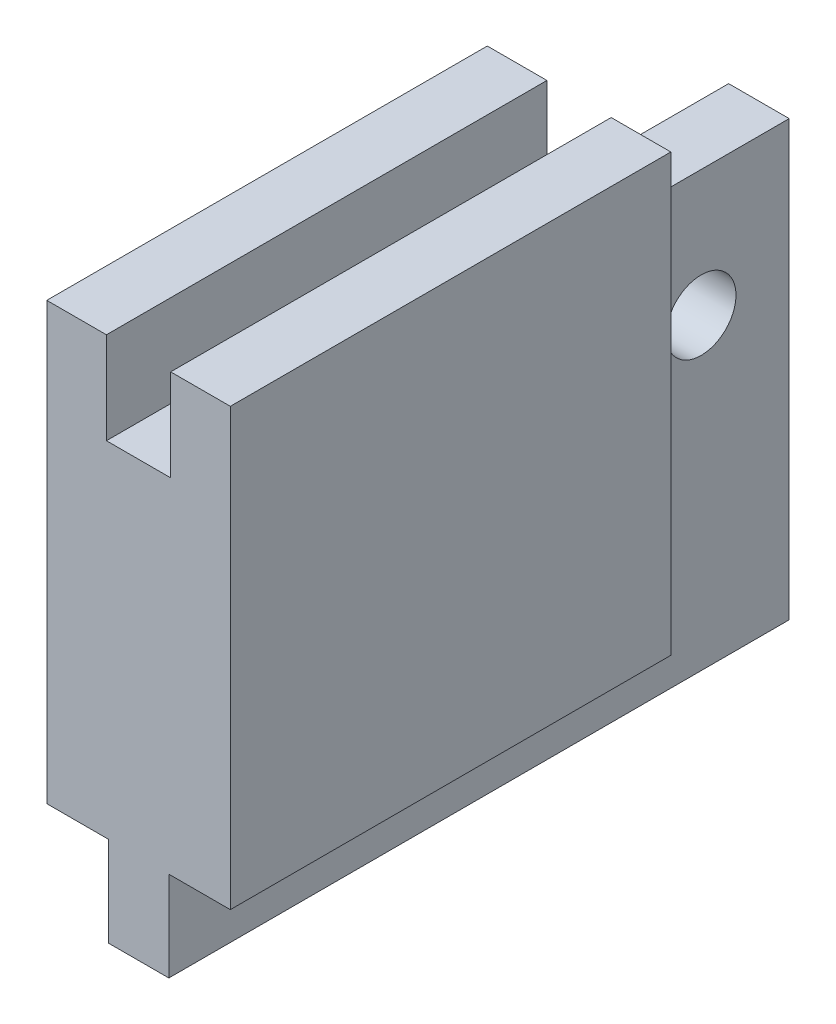
ISO-10303-21;
HEADER;
FILE_DESCRIPTION(('STEP AP214'),'2;1');
FILE_NAME('part.step','',(''),(''),'','','');
FILE_SCHEMA(('AUTOMOTIVE_DESIGN { 1 0 10303 214 1 1 1 1 }'));
ENDSEC;
DATA;
#1=APPLICATION_CONTEXT('core data for automotive mechanical design processes');
#2=APPLICATION_PROTOCOL_DEFINITION('international standard','automotive_design',2000,#1);
#3=PRODUCT_CONTEXT('',#1,'mechanical');
#4=PRODUCT('Part','Part','',(#3));
#5=PRODUCT_RELATED_PRODUCT_CATEGORY('part','',(#4));
#6=PRODUCT_DEFINITION_FORMATION('','',#4);
#7=PRODUCT_DEFINITION_CONTEXT('part definition',#1,'design');
#8=PRODUCT_DEFINITION('design','',#6,#7);
#9=PRODUCT_DEFINITION_SHAPE('','',#8);
#10=(LENGTH_UNIT() NAMED_UNIT(*) SI_UNIT(.MILLI.,.METRE.));
#11=(NAMED_UNIT(*) PLANE_ANGLE_UNIT() SI_UNIT($,.RADIAN.));
#12=(NAMED_UNIT(*) SI_UNIT($,.STERADIAN.) SOLID_ANGLE_UNIT());
#13=UNCERTAINTY_MEASURE_WITH_UNIT(LENGTH_MEASURE(1.E-05),#10,'distance_accuracy_value','');
#14=(GEOMETRIC_REPRESENTATION_CONTEXT(3) GLOBAL_UNCERTAINTY_ASSIGNED_CONTEXT((#13)) GLOBAL_UNIT_ASSIGNED_CONTEXT((#10,
#11,#12)) REPRESENTATION_CONTEXT('',''));
#15=CARTESIAN_POINT('',(0.,0.,0.));
#16=DIRECTION('',(0.,0.,1.));
#17=DIRECTION('',(1.,0.,0.));
#18=AXIS2_PLACEMENT_3D('',#15,#16,#17);
#19=CARTESIAN_POINT('',(-10.,23.75,0.));
#20=DIRECTION('',(0.,1.,0.));
#21=DIRECTION('',(0.,0.,1.));
#22=AXIS2_PLACEMENT_3D('',#19,#20,#21);
#23=PLANE('',#22);
#24=DIRECTION('',(1.,0.,0.));
#25=VECTOR('',#24,1.);
#26=CARTESIAN_POINT('',(-10.,23.75,0.));
#27=LINE('',#26,#25);
#28=CARTESIAN_POINT('',(-3.25,23.75,0.));
#29=VERTEX_POINT('',#28);
#30=CARTESIAN_POINT('',(0.,23.75,0.));
#31=VERTEX_POINT('',#30);
#32=EDGE_CURVE('E347',#29,#31,#27,.T.);
#33=ORIENTED_EDGE('',*,*,#32,.F.);
#34=DIRECTION('',(0.,0.,1.));
#35=VECTOR('',#34,1.);
#36=CARTESIAN_POINT('',(-3.25,23.75,20.75));
#37=LINE('',#36,#35);
#38=CARTESIAN_POINT('',(-3.25,23.75,24.));
#39=VERTEX_POINT('',#38);
#40=EDGE_CURVE('E224',#29,#39,#37,.T.);
#41=ORIENTED_EDGE('',*,*,#40,.T.);
#42=DIRECTION('',(1.,0.,0.));
#43=VECTOR('',#42,1.);
#44=CARTESIAN_POINT('',(-10.,23.75,24.));
#45=LINE('',#44,#43);
#46=CARTESIAN_POINT('',(0.,23.75,24.));
#47=VERTEX_POINT('',#46);
#48=EDGE_CURVE('E342',#39,#47,#45,.T.);
#49=ORIENTED_EDGE('',*,*,#48,.T.);
#50=DIRECTION('',(0.,0.,1.));
#51=VECTOR('',#50,1.);
#52=CARTESIAN_POINT('',(0.,23.75,0.));
#53=LINE('',#52,#51);
#54=EDGE_CURVE('E328',#31,#47,#53,.T.);
#55=ORIENTED_EDGE('',*,*,#54,.F.);
#56=EDGE_LOOP('',(#33,#41,#49,#55));
#57=FACE_BOUND('',#56,.T.);
#58=ADVANCED_FACE('F95',(#57),#23,.T.);
#59=CARTESIAN_POINT('',(-10.,0.,0.));
#60=DIRECTION('',(0.,0.,-1.));
#61=DIRECTION('',(-1.,0.,0.));
#62=AXIS2_PLACEMENT_3D('',#59,#60,#61);
#63=PLANE('',#62);
#64=DIRECTION('',(1.,0.,0.));
#65=VECTOR('',#64,1.);
#66=CARTESIAN_POINT('',(-10.,18.75,0.));
#67=LINE('',#66,#65);
#68=CARTESIAN_POINT('',(-3.35,18.75,0.));
#69=VERTEX_POINT('',#68);
#70=CARTESIAN_POINT('',(-3.25,18.75,0.));
#71=VERTEX_POINT('',#70);
#72=EDGE_CURVE('E238',#69,#71,#67,.T.);
#73=ORIENTED_EDGE('',*,*,#72,.T.);
#74=DIRECTION('',(0.,1.,0.));
#75=VECTOR('',#74,1.);
#76=CARTESIAN_POINT('',(-3.25,0.,0.));
#77=LINE('',#76,#75);
#78=EDGE_CURVE('E12',#71,#29,#77,.T.);
#79=ORIENTED_EDGE('',*,*,#78,.T.);
#80=ORIENTED_EDGE('',*,*,#32,.T.);
#81=DIRECTION('',(0.,1.,0.));
#82=VECTOR('',#81,1.);
#83=CARTESIAN_POINT('',(0.,0.,0.));
#84=LINE('',#83,#82);
#85=CARTESIAN_POINT('',(0.,0.,0.));
#86=VERTEX_POINT('',#85);
#87=EDGE_CURVE('E324',#86,#31,#84,.T.);
#88=ORIENTED_EDGE('',*,*,#87,.F.);
#89=DIRECTION('',(1.,0.,0.));
#90=VECTOR('',#89,1.);
#91=CARTESIAN_POINT('',(-10.,0.,0.));
#92=LINE('',#91,#90);
#93=CARTESIAN_POINT('',(-3.35,0.,0.));
#94=VERTEX_POINT('',#93);
#95=EDGE_CURVE('E320',#94,#86,#92,.T.);
#96=ORIENTED_EDGE('',*,*,#95,.F.);
#97=DIRECTION('',(0.,-1.,0.));
#98=VECTOR('',#97,1.);
#99=CARTESIAN_POINT('',(-3.35,23.75,0.));
#100=LINE('',#99,#98);
#101=EDGE_CURVE('E295',#69,#94,#100,.T.);
#102=ORIENTED_EDGE('',*,*,#101,.F.);
#103=EDGE_LOOP('',(#73,#79,#80,#88,#96,#102));
#104=FACE_BOUND('',#103,.T.);
#105=ADVANCED_FACE('F390',(#104),#63,.T.);
#106=CARTESIAN_POINT('',(-6.65,23.75,0.));
#107=DIRECTION('',(-1.,0.,0.));
#108=DIRECTION('',(0.,0.,1.));
#109=AXIS2_PLACEMENT_3D('',#106,#107,#108);
#110=PLANE('',#109);
#111=CARTESIAN_POINT('',(-6.65,11.875,-5.));
#112=DIRECTION('',(-1.,0.,0.));
#113=DIRECTION('',(0.,0.,1.));
#114=AXIS2_PLACEMENT_3D('',#111,#112,#113);
#115=CIRCLE('',#114,1.9);
#116=CARTESIAN_POINT('',(-6.65,11.875,-3.1));
#117=VERTEX_POINT('',#116);
#118=EDGE_CURVE('E251',#117,#117,#115,.T.);
#119=ORIENTED_EDGE('',*,*,#118,.F.);
#120=EDGE_LOOP('',(#119));
#121=FACE_BOUND('',#120,.T.);
#122=DIRECTION('',(0.,-1.,0.));
#123=VECTOR('',#122,1.);
#124=CARTESIAN_POINT('',(-6.65,23.75,0.));
#125=LINE('',#124,#123);
#126=CARTESIAN_POINT('',(-6.65,18.75,0.));
#127=VERTEX_POINT('',#126);
#128=CARTESIAN_POINT('',(-6.65,0.,0.));
#129=VERTEX_POINT('',#128);
#130=EDGE_CURVE('E291',#127,#129,#125,.T.);
#131=ORIENTED_EDGE('',*,*,#130,.F.);
#132=DIRECTION('',(0.,0.,-1.));
#133=VECTOR('',#132,1.);
#134=CARTESIAN_POINT('',(-6.65,18.75,0.));
#135=LINE('',#134,#133);
#136=CARTESIAN_POINT('',(-6.65,18.75,-9.8));
#137=VERTEX_POINT('',#136);
#138=EDGE_CURVE('E242',#127,#137,#135,.T.);
#139=ORIENTED_EDGE('',*,*,#138,.T.);
#140=DIRECTION('',(0.,-1.,0.));
#141=VECTOR('',#140,1.);
#142=CARTESIAN_POINT('',(-6.65,23.75,-9.8));
#143=LINE('',#142,#141);
#144=CARTESIAN_POINT('',(-6.65,-4.9,-9.8));
#145=VERTEX_POINT('',#144);
#146=EDGE_CURVE('E269',#137,#145,#143,.T.);
#147=ORIENTED_EDGE('',*,*,#146,.T.);
#148=DIRECTION('',(0.,0.,-1.));
#149=VECTOR('',#148,1.);
#150=CARTESIAN_POINT('',(-6.65,-4.9,0.));
#151=LINE('',#150,#149);
#152=CARTESIAN_POINT('',(-6.65,-4.9,24.));
#153=VERTEX_POINT('',#152);
#154=EDGE_CURVE('E264',#153,#145,#151,.T.);
#155=ORIENTED_EDGE('',*,*,#154,.F.);
#156=DIRECTION('',(0.,1.,0.));
#157=VECTOR('',#156,1.);
#158=CARTESIAN_POINT('',(-6.65,-4.9,24.));
#159=LINE('',#158,#157);
#160=CARTESIAN_POINT('',(-6.65,0.,24.));
#161=VERTEX_POINT('',#160);
#162=EDGE_CURVE('E273',#153,#161,#159,.T.);
#163=ORIENTED_EDGE('',*,*,#162,.T.);
#164=DIRECTION('',(0.,0.,-1.));
#165=VECTOR('',#164,1.);
#166=CARTESIAN_POINT('',(-6.65,0.,0.));
#167=LINE('',#166,#165);
#168=EDGE_CURVE('E265',#161,#129,#167,.T.);
#169=ORIENTED_EDGE('',*,*,#168,.T.);
#170=EDGE_LOOP('',(#131,#139,#147,#155,#163,#169));
#171=FACE_BOUND('',#170,.T.);
#172=ADVANCED_FACE('F367',(#121,#171),#110,.T.);
#173=CARTESIAN_POINT('',(-3.35,23.75,0.));
#174=DIRECTION('',(-1.,0.,0.));
#175=DIRECTION('',(0.,0.,1.));
#176=AXIS2_PLACEMENT_3D('',#173,#174,#175);
#177=PLANE('',#176);
#178=CARTESIAN_POINT('',(-3.35,11.875,-5.));
#179=DIRECTION('',(-1.,0.,0.));
#180=DIRECTION('',(0.,0.,1.));
#181=AXIS2_PLACEMENT_3D('',#178,#179,#180);
#182=CIRCLE('',#181,1.9);
#183=CARTESIAN_POINT('',(-3.35,11.875,-3.1));
#184=VERTEX_POINT('',#183);
#185=EDGE_CURVE('E255',#184,#184,#182,.F.);
#186=ORIENTED_EDGE('',*,*,#185,.F.);
#187=EDGE_LOOP('',(#186));
#188=FACE_BOUND('',#187,.T.);
#189=DIRECTION('',(0.,0.,-1.));
#190=VECTOR('',#189,1.);
#191=CARTESIAN_POINT('',(-3.35,18.75,0.));
#192=LINE('',#191,#190);
#193=CARTESIAN_POINT('',(-3.35,18.75,-9.8));
#194=VERTEX_POINT('',#193);
#195=EDGE_CURVE('E111',#69,#194,#192,.T.);
#196=ORIENTED_EDGE('',*,*,#195,.F.);
#197=ORIENTED_EDGE('',*,*,#101,.T.);
#198=DIRECTION('',(0.,0.,-1.));
#199=VECTOR('',#198,1.);
#200=CARTESIAN_POINT('',(-3.35,0.,0.));
#201=LINE('',#200,#199);
#202=CARTESIAN_POINT('',(-3.35,0.,24.));
#203=VERTEX_POINT('',#202);
#204=EDGE_CURVE('E270',#203,#94,#201,.T.);
#205=ORIENTED_EDGE('',*,*,#204,.F.);
#206=DIRECTION('',(0.,1.,0.));
#207=VECTOR('',#206,1.);
#208=CARTESIAN_POINT('',(-3.35,-4.9,24.));
#209=LINE('',#208,#207);
#210=CARTESIAN_POINT('',(-3.35,-4.9,24.));
#211=VERTEX_POINT('',#210);
#212=EDGE_CURVE('E281',#211,#203,#209,.T.);
#213=ORIENTED_EDGE('',*,*,#212,.F.);
#214=DIRECTION('',(0.,0.,-1.));
#215=VECTOR('',#214,1.);
#216=CARTESIAN_POINT('',(-3.35,-4.9,0.));
#217=LINE('',#216,#215);
#218=CARTESIAN_POINT('',(-3.35,-4.9,-9.8));
#219=VERTEX_POINT('',#218);
#220=EDGE_CURVE('E260',#211,#219,#217,.T.);
#221=ORIENTED_EDGE('',*,*,#220,.T.);
#222=DIRECTION('',(0.,-1.,0.));
#223=VECTOR('',#222,1.);
#224=CARTESIAN_POINT('',(-3.35,23.75,-9.8));
#225=LINE('',#224,#223);
#226=EDGE_CURVE('E298',#194,#219,#225,.T.);
#227=ORIENTED_EDGE('',*,*,#226,.F.);
#228=EDGE_LOOP('',(#196,#197,#205,#213,#221,#227));
#229=FACE_BOUND('',#228,.T.);
#230=ADVANCED_FACE('F358',(#188,#229),#177,.F.);
#231=CARTESIAN_POINT('',(0.,23.75,-9.8));
#232=DIRECTION('',(0.,0.,-1.));
#233=DIRECTION('',(0.,1.,0.));
#234=AXIS2_PLACEMENT_3D('',#231,#232,#233);
#235=PLANE('',#234);
#236=ORIENTED_EDGE('',*,*,#146,.F.);
#237=DIRECTION('',(1.,0.,0.));
#238=VECTOR('',#237,1.);
#239=CARTESIAN_POINT('',(0.,18.75,-9.8));
#240=LINE('',#239,#238);
#241=EDGE_CURVE('E104',#137,#194,#240,.T.);
#242=ORIENTED_EDGE('',*,*,#241,.T.);
#243=ORIENTED_EDGE('',*,*,#226,.T.);
#244=DIRECTION('',(1.,0.,0.));
#245=VECTOR('',#244,1.);
#246=CARTESIAN_POINT('',(-6.65,-4.9,-9.8));
#247=LINE('',#246,#245);
#248=EDGE_CURVE('E259',#145,#219,#247,.T.);
#249=ORIENTED_EDGE('',*,*,#248,.F.);
#250=EDGE_LOOP('',(#236,#242,#243,#249));
#251=FACE_BOUND('',#250,.T.);
#252=ADVANCED_FACE('F355',(#251),#235,.T.);
#253=CARTESIAN_POINT('',(-10.,0.,0.));
#254=DIRECTION('',(0.,-1.,0.));
#255=DIRECTION('',(0.,0.,-1.));
#256=AXIS2_PLACEMENT_3D('',#253,#254,#255);
#257=PLANE('',#256);
#258=DIRECTION('',(1.,0.,0.));
#259=VECTOR('',#258,1.);
#260=CARTESIAN_POINT('',(-10.,0.,24.));
#261=LINE('',#260,#259);
#262=CARTESIAN_POINT('',(0.,0.,24.));
#263=VERTEX_POINT('',#262);
#264=EDGE_CURVE('E119',#203,#263,#261,.T.);
#265=ORIENTED_EDGE('',*,*,#264,.F.);
#266=ORIENTED_EDGE('',*,*,#204,.T.);
#267=ORIENTED_EDGE('',*,*,#95,.T.);
#268=DIRECTION('',(0.,0.,-1.));
#269=VECTOR('',#268,1.);
#270=CARTESIAN_POINT('',(0.,0.,0.));
#271=LINE('',#270,#269);
#272=EDGE_CURVE('E294',#263,#86,#271,.T.);
#273=ORIENTED_EDGE('',*,*,#272,.F.);
#274=EDGE_LOOP('',(#265,#266,#267,#273));
#275=FACE_BOUND('',#274,.T.);
#276=ADVANCED_FACE('F404',(#275),#257,.T.);
#277=DIRECTION('',(0.,1.,0.));
#278=VECTOR('',#277,1.);
#279=CARTESIAN_POINT('',(-6.75,0.,0.));
#280=LINE('',#279,#278);
#281=CARTESIAN_POINT('',(-6.75,18.75,0.));
#282=VERTEX_POINT('',#281);
#283=CARTESIAN_POINT('',(-6.75,23.75,0.));
#284=VERTEX_POINT('',#283);
#285=EDGE_CURVE('E248',#282,#284,#280,.T.);
#286=ORIENTED_EDGE('',*,*,#285,.F.);
#287=DIRECTION('',(1.,0.,0.));
#288=VECTOR('',#287,1.);
#289=CARTESIAN_POINT('',(-10.,18.75,0.));
#290=LINE('',#289,#288);
#291=EDGE_CURVE('E205',#282,#127,#290,.T.);
#292=ORIENTED_EDGE('',*,*,#291,.T.);
#293=ORIENTED_EDGE('',*,*,#130,.T.);
#294=CARTESIAN_POINT('',(-10.,0.,0.));
#295=VERTEX_POINT('',#294);
#296=EDGE_CURVE('E348',#295,#129,#92,.T.);
#297=ORIENTED_EDGE('',*,*,#296,.F.);
#298=DIRECTION('',(0.,1.,0.));
#299=VECTOR('',#298,1.);
#300=CARTESIAN_POINT('',(-10.,0.,0.));
#301=LINE('',#300,#299);
#302=CARTESIAN_POINT('',(-10.,23.75,0.));
#303=VERTEX_POINT('',#302);
#304=EDGE_CURVE('E307',#295,#303,#301,.T.);
#305=ORIENTED_EDGE('',*,*,#304,.T.);
#306=EDGE_CURVE('E343',#303,#284,#27,.T.);
#307=ORIENTED_EDGE('',*,*,#306,.T.);
#308=EDGE_LOOP('',(#286,#292,#293,#297,#305,#307));
#309=FACE_BOUND('',#308,.T.);
#310=ADVANCED_FACE('F376',(#309),#63,.T.);
#311=ORIENTED_EDGE('',*,*,#168,.F.);
#312=CARTESIAN_POINT('',(-10.,0.,24.));
#313=VERTEX_POINT('',#312);
#314=EDGE_CURVE('E335',#313,#161,#261,.T.);
#315=ORIENTED_EDGE('',*,*,#314,.F.);
#316=DIRECTION('',(0.,0.,-1.));
#317=VECTOR('',#316,1.);
#318=CARTESIAN_POINT('',(-10.,0.,0.));
#319=LINE('',#318,#317);
#320=EDGE_CURVE('E303',#313,#295,#319,.T.);
#321=ORIENTED_EDGE('',*,*,#320,.T.);
#322=ORIENTED_EDGE('',*,*,#296,.T.);
#323=EDGE_LOOP('',(#311,#315,#321,#322));
#324=FACE_BOUND('',#323,.T.);
#325=ADVANCED_FACE('F97',(#324),#257,.T.);
#326=CARTESIAN_POINT('',(-10.,0.,24.));
#327=DIRECTION('',(0.,0.,1.));
#328=DIRECTION('',(1.,0.,0.));
#329=AXIS2_PLACEMENT_3D('',#326,#327,#328);
#330=PLANE('',#329);
#331=DIRECTION('',(0.,1.,0.));
#332=VECTOR('',#331,1.);
#333=CARTESIAN_POINT('',(-6.75,18.75,24.));
#334=LINE('',#333,#332);
#335=CARTESIAN_POINT('',(-6.75,18.75,24.));
#336=VERTEX_POINT('',#335);
#337=CARTESIAN_POINT('',(-6.75,23.75,24.));
#338=VERTEX_POINT('',#337);
#339=EDGE_CURVE('E212',#336,#338,#334,.T.);
#340=ORIENTED_EDGE('',*,*,#339,.T.);
#341=CARTESIAN_POINT('',(-10.,23.75,24.));
#342=VERTEX_POINT('',#341);
#343=EDGE_CURVE('E339',#342,#338,#45,.T.);
#344=ORIENTED_EDGE('',*,*,#343,.F.);
#345=DIRECTION('',(0.,-1.,0.));
#346=VECTOR('',#345,1.);
#347=CARTESIAN_POINT('',(-10.,0.,24.));
#348=LINE('',#347,#346);
#349=EDGE_CURVE('E316',#342,#313,#348,.T.);
#350=ORIENTED_EDGE('',*,*,#349,.T.);
#351=ORIENTED_EDGE('',*,*,#314,.T.);
#352=ORIENTED_EDGE('',*,*,#162,.F.);
#353=DIRECTION('',(1.,0.,0.));
#354=VECTOR('',#353,1.);
#355=CARTESIAN_POINT('',(-6.65,-4.9,24.));
#356=LINE('',#355,#354);
#357=EDGE_CURVE('E277',#153,#211,#356,.T.);
#358=ORIENTED_EDGE('',*,*,#357,.T.);
#359=ORIENTED_EDGE('',*,*,#212,.T.);
#360=ORIENTED_EDGE('',*,*,#264,.T.);
#361=DIRECTION('',(0.,-1.,0.));
#362=VECTOR('',#361,1.);
#363=CARTESIAN_POINT('',(0.,0.,24.));
#364=LINE('',#363,#362);
#365=EDGE_CURVE('E308',#47,#263,#364,.T.);
#366=ORIENTED_EDGE('',*,*,#365,.F.);
#367=ORIENTED_EDGE('',*,*,#48,.F.);
#368=DIRECTION('',(0.,1.,0.));
#369=VECTOR('',#368,1.);
#370=CARTESIAN_POINT('',(-3.25,18.75,24.));
#371=LINE('',#370,#369);
#372=CARTESIAN_POINT('',(-3.25,18.75,24.));
#373=VERTEX_POINT('',#372);
#374=EDGE_CURVE('E219',#373,#39,#371,.T.);
#375=ORIENTED_EDGE('',*,*,#374,.F.);
#376=DIRECTION('',(-1.,0.,0.));
#377=VECTOR('',#376,1.);
#378=CARTESIAN_POINT('',(-3.25,18.75,24.));
#379=LINE('',#378,#377);
#380=EDGE_CURVE('E202',#373,#336,#379,.T.);
#381=ORIENTED_EDGE('',*,*,#380,.T.);
#382=EDGE_LOOP('',(#340,#344,#350,#351,#352,#358,#359,#360,#366,#367,#375,#381));
#383=FACE_BOUND('',#382,.T.);
#384=ADVANCED_FACE('F221',(#383),#330,.T.);
#385=DIRECTION('',(0.,0.,1.));
#386=VECTOR('',#385,1.);
#387=CARTESIAN_POINT('',(-6.75,23.75,20.75));
#388=LINE('',#387,#386);
#389=EDGE_CURVE('E215',#284,#338,#388,.T.);
#390=ORIENTED_EDGE('',*,*,#389,.F.);
#391=ORIENTED_EDGE('',*,*,#306,.F.);
#392=DIRECTION('',(0.,0.,1.));
#393=VECTOR('',#392,1.);
#394=CARTESIAN_POINT('',(-10.,23.75,0.));
#395=LINE('',#394,#393);
#396=EDGE_CURVE('E312',#303,#342,#395,.T.);
#397=ORIENTED_EDGE('',*,*,#396,.T.);
#398=ORIENTED_EDGE('',*,*,#343,.T.);
#399=EDGE_LOOP('',(#390,#391,#397,#398));
#400=FACE_BOUND('',#399,.T.);
#401=ADVANCED_FACE('F378',(#400),#23,.T.);
#402=CARTESIAN_POINT('',(-10.,0.,0.));
#403=DIRECTION('',(-1.,0.,0.));
#404=DIRECTION('',(0.,0.,1.));
#405=AXIS2_PLACEMENT_3D('',#402,#403,#404);
#406=PLANE('',#405);
#407=ORIENTED_EDGE('',*,*,#320,.F.);
#408=ORIENTED_EDGE('',*,*,#349,.F.);
#409=ORIENTED_EDGE('',*,*,#396,.F.);
#410=ORIENTED_EDGE('',*,*,#304,.F.);
#411=EDGE_LOOP('',(#407,#408,#409,#410));
#412=FACE_BOUND('',#411,.T.);
#413=ADVANCED_FACE('F373',(#412),#406,.T.);
#414=CARTESIAN_POINT('',(0.,0.,0.));
#415=DIRECTION('',(-1.,0.,0.));
#416=DIRECTION('',(0.,0.,1.));
#417=AXIS2_PLACEMENT_3D('',#414,#415,#416);
#418=PLANE('',#417);
#419=ORIENTED_EDGE('',*,*,#272,.T.);
#420=ORIENTED_EDGE('',*,*,#87,.T.);
#421=ORIENTED_EDGE('',*,*,#54,.T.);
#422=ORIENTED_EDGE('',*,*,#365,.T.);
#423=EDGE_LOOP('',(#419,#420,#421,#422));
#424=FACE_BOUND('',#423,.T.);
#425=ADVANCED_FACE('F386',(#424),#418,.F.);
#426=CARTESIAN_POINT('',(0.,-4.9,0.));
#427=DIRECTION('',(0.,-1.,0.));
#428=DIRECTION('',(0.,0.,-1.));
#429=AXIS2_PLACEMENT_3D('',#426,#427,#428);
#430=PLANE('',#429);
#431=ORIENTED_EDGE('',*,*,#220,.F.);
#432=ORIENTED_EDGE('',*,*,#357,.F.);
#433=ORIENTED_EDGE('',*,*,#154,.T.);
#434=ORIENTED_EDGE('',*,*,#248,.T.);
#435=EDGE_LOOP('',(#431,#432,#433,#434));
#436=FACE_BOUND('',#435,.T.);
#437=ADVANCED_FACE('F363',(#436),#430,.T.);
#438=CARTESIAN_POINT('',(0.00100000000000013,11.875,-5.));
#439=DIRECTION('',(-1.,0.,0.));
#440=DIRECTION('',(0.,0.,1.));
#441=AXIS2_PLACEMENT_3D('',#438,#439,#440);
#442=CYLINDRICAL_SURFACE('',#441,1.9);
#443=CARTESIAN_POINT('',(-6.65,11.875,-3.1));
#444=CARTESIAN_POINT('',(-6.615625,11.875,-3.1));
#445=CARTESIAN_POINT('',(-6.58125,11.875,-3.1));
#446=CARTESIAN_POINT('',(-6.5125,11.875,-3.1));
#447=CARTESIAN_POINT('',(-6.478125,11.875,-3.1));
#448=CARTESIAN_POINT('',(-6.409375,11.875,-3.1));
#449=CARTESIAN_POINT('',(-6.375,11.875,-3.1));
#450=CARTESIAN_POINT('',(-6.30625,11.875,-3.1));
#451=CARTESIAN_POINT('',(-6.271875,11.875,-3.1));
#452=CARTESIAN_POINT('',(-6.203125,11.875,-3.1));
#453=CARTESIAN_POINT('',(-6.16875,11.875,-3.1));
#454=CARTESIAN_POINT('',(-6.1,11.875,-3.1));
#455=CARTESIAN_POINT('',(-6.065625,11.875,-3.1));
#456=CARTESIAN_POINT('',(-5.996875,11.875,-3.1));
#457=CARTESIAN_POINT('',(-5.9625,11.875,-3.1));
#458=CARTESIAN_POINT('',(-5.89375,11.875,-3.1));
#459=CARTESIAN_POINT('',(-5.859375,11.875,-3.1));
#460=CARTESIAN_POINT('',(-5.790625,11.875,-3.1));
#461=CARTESIAN_POINT('',(-5.75625,11.875,-3.1));
#462=CARTESIAN_POINT('',(-5.6875,11.875,-3.1));
#463=CARTESIAN_POINT('',(-5.653125,11.875,-3.1));
#464=CARTESIAN_POINT('',(-5.584375,11.875,-3.1));
#465=CARTESIAN_POINT('',(-5.55,11.875,-3.1));
#466=CARTESIAN_POINT('',(-5.48125,11.875,-3.1));
#467=CARTESIAN_POINT('',(-5.446875,11.875,-3.1));
#468=CARTESIAN_POINT('',(-5.378125,11.875,-3.1));
#469=CARTESIAN_POINT('',(-5.34375,11.875,-3.1));
#470=CARTESIAN_POINT('',(-5.275,11.875,-3.1));
#471=CARTESIAN_POINT('',(-5.240625,11.875,-3.1));
#472=CARTESIAN_POINT('',(-5.171875,11.875,-3.1));
#473=CARTESIAN_POINT('',(-5.1375,11.875,-3.1));
#474=CARTESIAN_POINT('',(-5.06875,11.875,-3.1));
#475=CARTESIAN_POINT('',(-5.034375,11.875,-3.1));
#476=CARTESIAN_POINT('',(-4.965625,11.875,-3.1));
#477=CARTESIAN_POINT('',(-4.93125,11.875,-3.1));
#478=CARTESIAN_POINT('',(-4.8625,11.875,-3.1));
#479=CARTESIAN_POINT('',(-4.828125,11.875,-3.1));
#480=CARTESIAN_POINT('',(-4.759375,11.875,-3.1));
#481=CARTESIAN_POINT('',(-4.725,11.875,-3.1));
#482=CARTESIAN_POINT('',(-4.65625,11.875,-3.1));
#483=CARTESIAN_POINT('',(-4.621875,11.875,-3.1));
#484=CARTESIAN_POINT('',(-4.553125,11.875,-3.1));
#485=CARTESIAN_POINT('',(-4.51875,11.875,-3.1));
#486=CARTESIAN_POINT('',(-4.45,11.875,-3.1));
#487=CARTESIAN_POINT('',(-4.415625,11.875,-3.1));
#488=CARTESIAN_POINT('',(-4.346875,11.875,-3.1));
#489=CARTESIAN_POINT('',(-4.3125,11.875,-3.1));
#490=CARTESIAN_POINT('',(-4.24375,11.875,-3.1));
#491=CARTESIAN_POINT('',(-4.209375,11.875,-3.1));
#492=CARTESIAN_POINT('',(-4.140625,11.875,-3.1));
#493=CARTESIAN_POINT('',(-4.10625,11.875,-3.1));
#494=CARTESIAN_POINT('',(-4.0375,11.875,-3.1));
#495=CARTESIAN_POINT('',(-4.003125,11.875,-3.1));
#496=CARTESIAN_POINT('',(-3.934375,11.875,-3.1));
#497=CARTESIAN_POINT('',(-3.9,11.875,-3.1));
#498=CARTESIAN_POINT('',(-3.83125,11.875,-3.1));
#499=CARTESIAN_POINT('',(-3.796875,11.875,-3.1));
#500=CARTESIAN_POINT('',(-3.728125,11.875,-3.1));
#501=CARTESIAN_POINT('',(-3.69375,11.875,-3.1));
#502=CARTESIAN_POINT('',(-3.625,11.875,-3.1));
#503=CARTESIAN_POINT('',(-3.590625,11.875,-3.1));
#504=CARTESIAN_POINT('',(-3.521875,11.875,-3.1));
#505=CARTESIAN_POINT('',(-3.4875,11.875,-3.1));
#506=CARTESIAN_POINT('',(-3.41875,11.875,-3.1));
#507=CARTESIAN_POINT('',(-3.384375,11.875,-3.1));
#508=CARTESIAN_POINT('',(-3.35,11.875,-3.1));
#509=B_SPLINE_CURVE_WITH_KNOTS('',3,(#443,#444,#445,#446,#447,#448,#449,#450,#451,#452,#453,
#454,#455,#456,#457,#458,#459,#460,#461,#462,#463,#464,#465,#466,#467,#468,#469,#470,#471,#472,
#473,#474,#475,#476,#477,#478,#479,#480,#481,#482,#483,#484,#485,#486,#487,#488,#489,#490,#491,
#492,#493,#494,#495,#496,#497,#498,#499,#500,#501,#502,#503,#504,#505,#506,#507,#508),
.UNSPECIFIED.,.F.,.F.,(4,2,2,2,2,2,2,2,2,2,2,2,2,2,2,2,2,2,2,2,2,2,2,2,2,2,2,2,2,2,2,2,4),(0.,
0.103125,0.20625,0.309375,0.4125,0.515625,0.618749999999999,0.721875,0.824999999999999,0.928125,
1.03125,1.134375,1.2375,1.340625,1.44375,1.546875,1.65,1.753125,1.85625,1.959375,2.0625,
2.165625,2.26875,2.371875,2.475,2.578125,2.68125,2.784375,2.8875,2.990625,3.09375,3.196875,3.3),.UNSPECIFIED.);
#510=EDGE_CURVE('BSEAM414',#117,#184,#509,.T.);
#511=ORIENTED_EDGE('',*,*,#118,.T.);
#512=ORIENTED_EDGE('',*,*,#185,.T.);
#513=ORIENTED_EDGE('',*,*,#510,.T.);
#514=ORIENTED_EDGE('',*,*,#510,.F.);
#515=EDGE_LOOP('',(#511,#513,#512,#514));
#516=FACE_BOUND('',#515,.T.);
#517=ADVANCED_FACE('F414',(#516),#442,.F.);
#518=CARTESIAN_POINT('',(-6.75,18.75,20.75));
#519=DIRECTION('',(-1.,0.,0.));
#520=DIRECTION('',(0.,0.,1.));
#521=AXIS2_PLACEMENT_3D('',#518,#519,#520);
#522=PLANE('',#521);
#523=ORIENTED_EDGE('',*,*,#285,.T.);
#524=ORIENTED_EDGE('',*,*,#389,.T.);
#525=ORIENTED_EDGE('',*,*,#339,.F.);
#526=DIRECTION('',(0.,0.,1.));
#527=VECTOR('',#526,1.);
#528=CARTESIAN_POINT('',(-6.75,18.75,20.75));
#529=LINE('',#528,#527);
#530=EDGE_CURVE('E197',#282,#336,#529,.T.);
#531=ORIENTED_EDGE('',*,*,#530,.F.);
#532=EDGE_LOOP('',(#523,#524,#525,#531));
#533=FACE_BOUND('',#532,.T.);
#534=ADVANCED_FACE('F213',(#533),#522,.F.);
#535=CARTESIAN_POINT('',(-3.25,18.75,20.75));
#536=DIRECTION('',(-1.,0.,0.));
#537=DIRECTION('',(0.,0.,1.));
#538=AXIS2_PLACEMENT_3D('',#535,#536,#537);
#539=PLANE('',#538);
#540=DIRECTION('',(0.,0.,1.));
#541=VECTOR('',#540,1.);
#542=CARTESIAN_POINT('',(-3.25,18.75,20.75));
#543=LINE('',#542,#541);
#544=EDGE_CURVE('E209',#71,#373,#543,.T.);
#545=ORIENTED_EDGE('',*,*,#544,.T.);
#546=ORIENTED_EDGE('',*,*,#374,.T.);
#547=ORIENTED_EDGE('',*,*,#40,.F.);
#548=ORIENTED_EDGE('',*,*,#78,.F.);
#549=EDGE_LOOP('',(#545,#546,#547,#548));
#550=FACE_BOUND('',#549,.T.);
#551=ADVANCED_FACE('F428',(#550),#539,.T.);
#552=CARTESIAN_POINT('',(0.,18.75,0.));
#553=DIRECTION('',(0.,1.,0.));
#554=DIRECTION('',(0.,0.,1.));
#555=AXIS2_PLACEMENT_3D('',#552,#553,#554);
#556=PLANE('',#555);
#557=ORIENTED_EDGE('',*,*,#530,.T.);
#558=ORIENTED_EDGE('',*,*,#380,.F.);
#559=ORIENTED_EDGE('',*,*,#544,.F.);
#560=ORIENTED_EDGE('',*,*,#72,.F.);
#561=ORIENTED_EDGE('',*,*,#195,.T.);
#562=ORIENTED_EDGE('',*,*,#241,.F.);
#563=ORIENTED_EDGE('',*,*,#138,.F.);
#564=ORIENTED_EDGE('',*,*,#291,.F.);
#565=EDGE_LOOP('',(#557,#558,#559,#560,#561,#562,#563,#564));
#566=FACE_BOUND('',#565,.T.);
#567=ADVANCED_FACE('F199',(#566),#556,.T.);
#568=CLOSED_SHELL('',(#58,#105,#172,#230,#252,#276,#310,#325,#384,#401,#413,#425,#437,#517,#534,
#551,#567));
#569=MANIFOLD_SOLID_BREP('B2',#568);
#570=ADVANCED_BREP_SHAPE_REPRESENTATION('',(#18,#569),#14);
#571=SHAPE_DEFINITION_REPRESENTATION(#9,#570);
ENDSEC;
END-ISO-10303-21;
